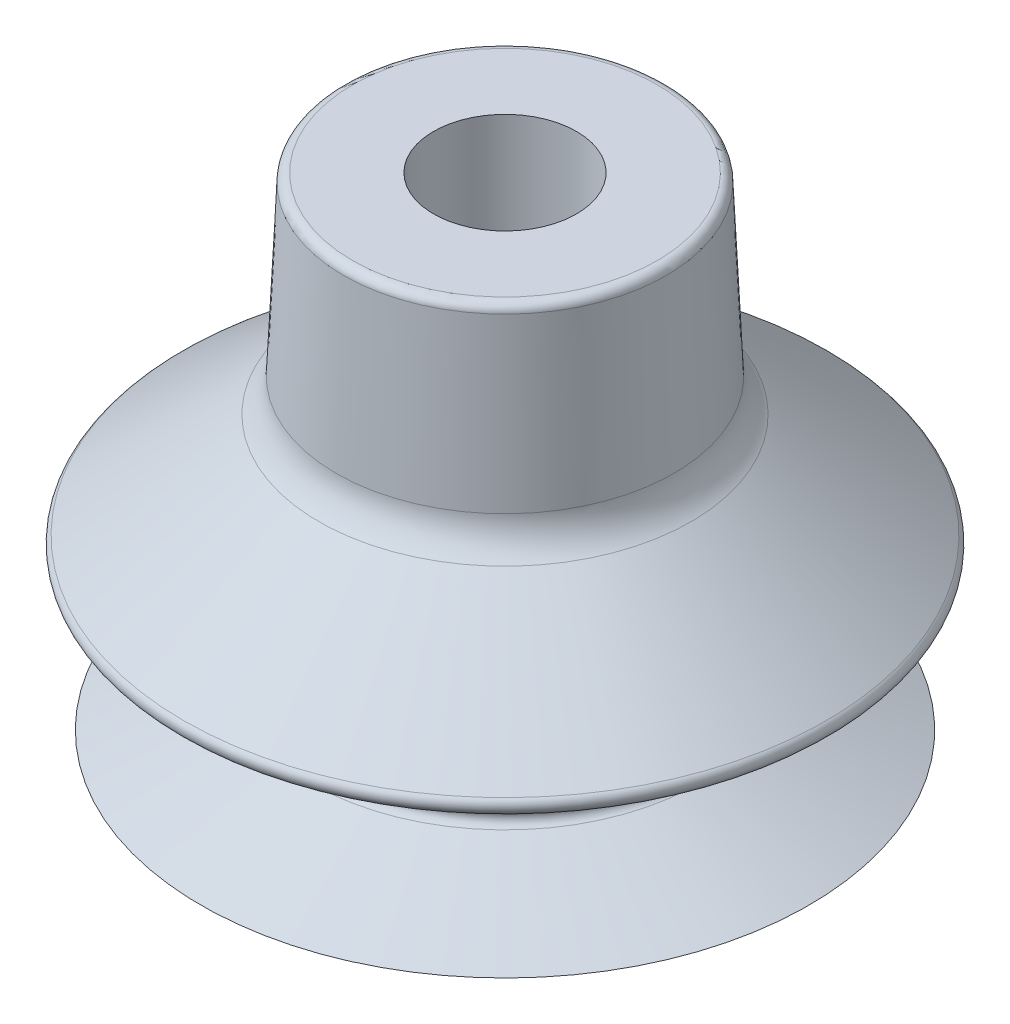
ISO-10303-21;
HEADER;
FILE_DESCRIPTION(('STEP AP214'),'2;1');
FILE_NAME('part.step','',(''),(''),'','','');
FILE_SCHEMA(('AUTOMOTIVE_DESIGN { 1 0 10303 214 1 1 1 1 }'));
ENDSEC;
DATA;
#1=APPLICATION_CONTEXT('core data for automotive mechanical design processes');
#2=APPLICATION_PROTOCOL_DEFINITION('international standard','automotive_design',2000,#1);
#3=PRODUCT_CONTEXT('',#1,'mechanical');
#4=PRODUCT('Part','Part','',(#3));
#5=PRODUCT_RELATED_PRODUCT_CATEGORY('part','',(#4));
#6=PRODUCT_DEFINITION_FORMATION('','',#4);
#7=PRODUCT_DEFINITION_CONTEXT('part definition',#1,'design');
#8=PRODUCT_DEFINITION('design','',#6,#7);
#9=PRODUCT_DEFINITION_SHAPE('','',#8);
#10=(LENGTH_UNIT() NAMED_UNIT(*) SI_UNIT(.MILLI.,.METRE.));
#11=(NAMED_UNIT(*) PLANE_ANGLE_UNIT() SI_UNIT($,.RADIAN.));
#12=(NAMED_UNIT(*) SI_UNIT($,.STERADIAN.) SOLID_ANGLE_UNIT());
#13=UNCERTAINTY_MEASURE_WITH_UNIT(LENGTH_MEASURE(1.E-05),#10,'distance_accuracy_value','');
#14=(GEOMETRIC_REPRESENTATION_CONTEXT(3) GLOBAL_UNCERTAINTY_ASSIGNED_CONTEXT((#13)) GLOBAL_UNIT_ASSIGNED_CONTEXT((#10,
#11,#12)) REPRESENTATION_CONTEXT('',''));
#15=CARTESIAN_POINT('',(0.,0.,0.));
#16=DIRECTION('',(0.,0.,1.));
#17=DIRECTION('',(1.,0.,0.));
#18=AXIS2_PLACEMENT_3D('',#15,#16,#17);
#19=CARTESIAN_POINT('',(0.,0.,0.));
#20=DIRECTION('',(0.,-1.,0.));
#21=DIRECTION('',(0.,0.,-1.));
#22=AXIS2_PLACEMENT_3D('',#19,#20,#21);
#23=CONICAL_SURFACE('',#22,18.5,0.90975315794421);
#24=CARTESIAN_POINT('',(0.,6.2920590469125,0.));
#25=DIRECTION('',(0.,-1.,0.));
#26=DIRECTION('',(0.,0.,-1.));
#27=AXIS2_PLACEMENT_3D('',#24,#25,#26);
#28=CIRCLE('',#27,10.4102097968268);
#29=CARTESIAN_POINT('',(0.,6.2920590469125,-10.4102097968268));
#30=VERTEX_POINT('',#29);
#31=EDGE_CURVE('E37',#30,#30,#28,.T.);
#32=ORIENTED_EDGE('',*,*,#31,.T.);
#33=EDGE_LOOP('',(#32));
#34=FACE_BOUND('',#33,.T.);
#35=CARTESIAN_POINT('',(0.,0.419705562361745,0.));
#36=DIRECTION('',(0.,1.,0.));
#37=DIRECTION('',(0.,0.,1.));
#38=AXIS2_PLACEMENT_3D('',#35,#36,#37);
#39=CIRCLE('',#38,17.9603785626778);
#40=CARTESIAN_POINT('',(0.,0.419705562361745,17.9603785626778));
#41=VERTEX_POINT('',#40);
#42=EDGE_CURVE('E50',#41,#41,#39,.T.);
#43=ORIENTED_EDGE('',*,*,#42,.T.);
#44=EDGE_LOOP('',(#43));
#45=FACE_BOUND('',#44,.T.);
#46=ADVANCED_FACE('F30',(#34,#45),#23,.T.);
#47=CARTESIAN_POINT('',(0.,-5.822892874515,0.));
#48=DIRECTION('',(0.,1.,0.));
#49=DIRECTION('',(0.,0.,1.));
#50=AXIS2_PLACEMENT_3D('',#47,#48,#49);
#51=CONICAL_SURFACE('',#50,10.0238595360316,0.968865864937722);
#52=CARTESIAN_POINT('',(0.,-0.387092574800041,0.));
#53=DIRECTION('',(0.,-1.,0.));
#54=DIRECTION('',(0.,0.,-1.));
#55=AXIS2_PLACEMENT_3D('',#52,#53,#54);
#56=CIRCLE('',#55,17.9365256055243);
#57=CARTESIAN_POINT('',(0.,-0.387092574800041,-17.9365256055243));
#58=VERTEX_POINT('',#57);
#59=EDGE_CURVE('E53',#58,#58,#56,.T.);
#60=ORIENTED_EDGE('',*,*,#59,.T.);
#61=EDGE_LOOP('',(#60));
#62=FACE_BOUND('',#61,.T.);
#63=CARTESIAN_POINT('',(0.,-5.32221728329887,0.));
#64=DIRECTION('',(0.,1.,0.));
#65=DIRECTION('',(0.,0.,1.));
#66=AXIS2_PLACEMENT_3D('',#63,#64,#65);
#67=CIRCLE('',#66,10.7526719544435);
#68=CARTESIAN_POINT('',(0.,-5.32221728329887,10.7526719544435));
#69=VERTEX_POINT('',#68);
#70=EDGE_CURVE('E56',#69,#69,#67,.T.);
#71=ORIENTED_EDGE('',*,*,#70,.T.);
#72=EDGE_LOOP('',(#71));
#73=FACE_BOUND('',#72,.T.);
#74=ADVANCED_FACE('F111',(#62,#73),#51,.T.);
#75=CARTESIAN_POINT('',(0.,-9.,0.));
#76=DIRECTION('',(0.,-1.,0.));
#77=DIRECTION('',(0.,0.,-1.));
#78=AXIS2_PLACEMENT_3D('',#75,#76,#77);
#79=CONICAL_SURFACE('',#78,17.,1.14344033221867);
#80=CARTESIAN_POINT('',(0.,-6.18937170170866,0.));
#81=DIRECTION('',(0.,-1.,0.));
#82=DIRECTION('',(0.,0.,-1.));
#83=AXIS2_PLACEMENT_3D('',#80,#81,#82);
#84=CIRCLE('',#83,10.8285562851798);
#85=CARTESIAN_POINT('',(0.,-6.18937170170866,-10.8285562851798));
#86=VERTEX_POINT('',#85);
#87=EDGE_CURVE('E45',#86,#86,#84,.T.);
#88=ORIENTED_EDGE('',*,*,#87,.T.);
#89=EDGE_LOOP('',(#88));
#90=FACE_BOUND('',#89,.T.);
#91=CARTESIAN_POINT('',(0.,-9.,0.));
#92=DIRECTION('',(0.,-1.,0.));
#93=DIRECTION('',(0.,0.,-1.));
#94=AXIS2_PLACEMENT_3D('',#91,#92,#93);
#95=CIRCLE('',#94,17.);
#96=CARTESIAN_POINT('',(0.,-9.,-17.));
#97=VERTEX_POINT('',#96);
#98=EDGE_CURVE('E80',#97,#97,#95,.T.);
#99=ORIENTED_EDGE('',*,*,#98,.F.);
#100=EDGE_LOOP('',(#99));
#101=FACE_BOUND('',#100,.T.);
#102=ADVANCED_FACE('F116',(#90,#101),#79,.T.);
#103=CARTESIAN_POINT('',(17.,-9.,0.));
#104=DIRECTION('',(0.,-1.,0.));
#105=DIRECTION('',(0.,0.,-1.));
#106=AXIS2_PLACEMENT_3D('',#103,#104,#105);
#107=PLANE('',#106);
#108=ORIENTED_EDGE('',*,*,#98,.T.);
#109=EDGE_LOOP('',(#108));
#110=FACE_BOUND('',#109,.T.);
#111=CARTESIAN_POINT('',(0.,-9.,0.));
#112=DIRECTION('',(0.,-1.,0.));
#113=DIRECTION('',(0.,0.,-1.));
#114=AXIS2_PLACEMENT_3D('',#111,#112,#113);
#115=CIRCLE('',#114,14.5872570754788);
#116=CARTESIAN_POINT('',(0.,-9.,-14.5872570754788));
#117=VERTEX_POINT('',#116);
#118=EDGE_CURVE('E83',#117,#117,#115,.T.);
#119=ORIENTED_EDGE('',*,*,#118,.F.);
#120=EDGE_LOOP('',(#119));
#121=FACE_BOUND('',#120,.T.);
#122=ADVANCED_FACE('F163',(#110,#121),#107,.T.);
#123=CARTESIAN_POINT('',(0.,-6.,0.));
#124=DIRECTION('',(0.,-1.,0.));
#125=DIRECTION('',(0.,0.,-1.));
#126=AXIS2_PLACEMENT_3D('',#123,#124,#125);
#127=CONICAL_SURFACE('',#126,8.,1.14344033221867);
#128=CARTESIAN_POINT('',(0.,-6.36647882719366,0.));
#129=DIRECTION('',(0.,1.,0.));
#130=DIRECTION('',(0.,0.,1.));
#131=AXIS2_PLACEMENT_3D('',#128,#129,#130);
#132=CIRCLE('',#131,8.80469674914821);
#133=CARTESIAN_POINT('',(0.,-6.36647882719366,8.80469674914821));
#134=VERTEX_POINT('',#133);
#135=EDGE_CURVE('E41',#134,#134,#132,.T.);
#136=ORIENTED_EDGE('',*,*,#135,.T.);
#137=EDGE_LOOP('',(#136));
#138=FACE_BOUND('',#137,.T.);
#139=ORIENTED_EDGE('',*,*,#118,.T.);
#140=EDGE_LOOP('',(#139));
#141=FACE_BOUND('',#140,.T.);
#142=ADVANCED_FACE('F154',(#138,#141),#127,.F.);
#143=CARTESIAN_POINT('',(0.,0.0500589073471671,0.));
#144=DIRECTION('',(0.,1.,0.));
#145=DIRECTION('',(0.,0.,1.));
#146=AXIS2_PLACEMENT_3D('',#143,#144,#145);
#147=CONICAL_SURFACE('',#146,16.8068165118406,0.968865864937722);
#148=CARTESIAN_POINT('',(0.,-0.337033667452878,0.));
#149=DIRECTION('',(0.,1.,0.));
#150=DIRECTION('',(0.,0.,1.));
#151=AXIS2_PLACEMENT_3D('',#148,#149,#150);
#152=CIRCLE('',#151,16.2433421173649);
#153=CARTESIAN_POINT('',(0.,-0.337033667452878,16.2433421173649));
#154=VERTEX_POINT('',#153);
#155=EDGE_CURVE('E59',#154,#154,#152,.T.);
#156=ORIENTED_EDGE('',*,*,#155,.T.);
#157=EDGE_LOOP('',(#156));
#158=FACE_BOUND('',#157,.T.);
#159=CARTESIAN_POINT('',(0.,-5.49932440878387,0.));
#160=DIRECTION('',(0.,-1.,0.));
#161=DIRECTION('',(0.,0.,-1.));
#162=AXIS2_PLACEMENT_3D('',#159,#160,#161);
#163=CIRCLE('',#162,8.72881241841183);
#164=CARTESIAN_POINT('',(0.,-5.49932440878387,-8.72881241841183));
#165=VERTEX_POINT('',#164);
#166=EDGE_CURVE('E62',#165,#165,#163,.T.);
#167=ORIENTED_EDGE('',*,*,#166,.T.);
#168=EDGE_LOOP('',(#167));
#169=FACE_BOUND('',#168,.T.);
#170=ADVANCED_FACE('F152',(#158,#169),#147,.F.);
#171=CARTESIAN_POINT('',(0.,5.,0.));
#172=DIRECTION('',(0.,-1.,0.));
#173=DIRECTION('',(0.,0.,-1.));
#174=AXIS2_PLACEMENT_3D('',#171,#172,#173);
#175=CONICAL_SURFACE('',#174,10.4426065355727,0.90975315794421);
#176=CARTESIAN_POINT('',(0.,4.89467610868816,0.));
#177=DIRECTION('',(0.,-1.,0.));
#178=DIRECTION('',(0.,0.,-1.));
#179=AXIS2_PLACEMENT_3D('',#176,#177,#178);
#180=CIRCLE('',#179,10.5780229672593);
#181=CARTESIAN_POINT('',(0.,4.89467610868816,-10.5780229672593));
#182=VERTEX_POINT('',#181);
#183=EDGE_CURVE('E71',#182,#182,#180,.F.);
#184=ORIENTED_EDGE('',*,*,#183,.T.);
#185=EDGE_LOOP('',(#184));
#186=FACE_BOUND('',#185,.T.);
#187=CARTESIAN_POINT('',(0.,0.469764469708915,0.));
#188=DIRECTION('',(0.,-1.,0.));
#189=DIRECTION('',(0.,0.,-1.));
#190=AXIS2_PLACEMENT_3D('',#187,#188,#189);
#191=CIRCLE('',#190,16.2671950745183);
#192=CARTESIAN_POINT('',(0.,0.469764469708915,-16.2671950745183));
#193=VERTEX_POINT('',#192);
#194=EDGE_CURVE('E74',#193,#193,#191,.T.);
#195=ORIENTED_EDGE('',*,*,#194,.T.);
#196=EDGE_LOOP('',(#195));
#197=FACE_BOUND('',#196,.T.);
#198=ADVANCED_FACE('F107',(#186,#197),#175,.F.);
#199=CARTESIAN_POINT('',(10.4426065355727,5.,0.));
#200=DIRECTION('',(0.,-1.,0.));
#201=DIRECTION('',(0.,0.,-1.));
#202=AXIS2_PLACEMENT_3D('',#199,#200,#201);
#203=PLANE('',#202);
#204=CARTESIAN_POINT('',(0.,5.,0.));
#205=DIRECTION('',(0.,-1.,0.));
#206=DIRECTION('',(0.,0.,-1.));
#207=AXIS2_PLACEMENT_3D('',#204,#205,#206);
#208=CIRCLE('',#207,10.2710526605018);
#209=CARTESIAN_POINT('',(0.,5.,-10.2710526605018));
#210=VERTEX_POINT('',#209);
#211=EDGE_CURVE('E77',#210,#210,#208,.T.);
#212=ORIENTED_EDGE('',*,*,#211,.T.);
#213=EDGE_LOOP('',(#212));
#214=FACE_BOUND('',#213,.T.);
#215=CARTESIAN_POINT('',(0.,5.,0.));
#216=DIRECTION('',(0.,-1.,0.));
#217=DIRECTION('',(0.,0.,-1.));
#218=AXIS2_PLACEMENT_3D('',#215,#216,#217);
#219=CIRCLE('',#218,4.);
#220=CARTESIAN_POINT('',(0.,5.,-4.));
#221=VERTEX_POINT('',#220);
#222=EDGE_CURVE('E86',#221,#221,#219,.T.);
#223=ORIENTED_EDGE('',*,*,#222,.F.);
#224=EDGE_LOOP('',(#223));
#225=FACE_BOUND('',#224,.T.);
#226=ADVANCED_FACE('F97',(#214,#225),#203,.T.);
#227=CARTESIAN_POINT('',(0.,0.,0.));
#228=DIRECTION('',(0.,-1.,0.));
#229=DIRECTION('',(0.,0.,-1.));
#230=AXIS2_PLACEMENT_3D('',#227,#228,#229);
#231=CYLINDRICAL_SURFACE('',#230,4.);
#232=ORIENTED_EDGE('',*,*,#222,.T.);
#233=EDGE_LOOP('',(#232));
#234=FACE_BOUND('',#233,.T.);
#235=CARTESIAN_POINT('',(0.,18.,0.));
#236=DIRECTION('',(0.,-1.,0.));
#237=DIRECTION('',(0.,0.,-1.));
#238=AXIS2_PLACEMENT_3D('',#235,#236,#237);
#239=CIRCLE('',#238,4.);
#240=CARTESIAN_POINT('',(0.,18.,-4.));
#241=VERTEX_POINT('',#240);
#242=EDGE_CURVE('E89',#241,#241,#239,.T.);
#243=ORIENTED_EDGE('',*,*,#242,.F.);
#244=EDGE_LOOP('',(#243));
#245=FACE_BOUND('',#244,.T.);
#246=ADVANCED_FACE('F95',(#234,#245),#231,.F.);
#247=CARTESIAN_POINT('',(4.,18.,0.));
#248=DIRECTION('',(0.,1.,0.));
#249=DIRECTION('',(0.,0.,1.));
#250=AXIS2_PLACEMENT_3D('',#247,#248,#249);
#251=PLANE('',#250);
#252=CARTESIAN_POINT('',(0.,18.,0.));
#253=DIRECTION('',(0.,1.,0.));
#254=DIRECTION('',(0.,0.,1.));
#255=AXIS2_PLACEMENT_3D('',#252,#253,#254);
#256=CIRCLE('',#255,8.52221101032852);
#257=CARTESIAN_POINT('',(0.,18.,8.52221101032852));
#258=VERTEX_POINT('',#257);
#259=EDGE_CURVE('E65',#258,#258,#256,.T.);
#260=ORIENTED_EDGE('',*,*,#259,.T.);
#261=EDGE_LOOP('',(#260));
#262=FACE_BOUND('',#261,.T.);
#263=ORIENTED_EDGE('',*,*,#242,.T.);
#264=EDGE_LOOP('',(#263));
#265=FACE_BOUND('',#264,.T.);
#266=ADVANCED_FACE('F93',(#262,#265),#251,.T.);
#267=CARTESIAN_POINT('',(0.,7.,0.));
#268=DIRECTION('',(0.,-1.,0.));
#269=DIRECTION('',(0.,0.,-1.));
#270=AXIS2_PLACEMENT_3D('',#267,#268,#269);
#271=CONICAL_SURFACE('',#270,9.5,0.0454232794215771);
#272=CARTESIAN_POINT('',(0.,8.1519204380567,0.));
#273=DIRECTION('',(0.,-1.,0.));
#274=DIRECTION('',(0.,0.,-1.));
#275=AXIS2_PLACEMENT_3D('',#272,#273,#274);
#276=CIRCLE('',#275,9.44763998008833);
#277=CARTESIAN_POINT('',(0.,8.1519204380567,-9.44763998008833));
#278=VERTEX_POINT('',#277);
#279=EDGE_CURVE('E10',#278,#278,#276,.F.);
#280=ORIENTED_EDGE('',*,*,#279,.T.);
#281=EDGE_LOOP('',(#280));
#282=FACE_BOUND('',#281,.T.);
#283=CARTESIAN_POINT('',(0.,17.5227038304593,0.));
#284=DIRECTION('',(0.,1.,0.));
#285=DIRECTION('',(0.,0.,1.));
#286=AXIS2_PLACEMENT_3D('',#283,#284,#285);
#287=CIRCLE('',#286,9.02169528043366);
#288=CARTESIAN_POINT('',(0.,17.5227038304593,9.02169528043366));
#289=VERTEX_POINT('',#288);
#290=EDGE_CURVE('E68',#289,#289,#287,.F.);
#291=ORIENTED_EDGE('',*,*,#290,.T.);
#292=EDGE_LOOP('',(#291));
#293=FACE_BOUND('',#292,.T.);
#294=ADVANCED_FACE('F104',(#282,#293),#271,.T.);
#295=CARTESIAN_POINT('',(0.,4.5,0.));
#296=DIRECTION('',(0.,-1.,0.));
#297=DIRECTION('',(0.,0.,-1.));
#298=AXIS2_PLACEMENT_3D('',#295,#296,#297);
#299=TOROIDAL_SURFACE('',#298,10.2710526605018,0.5);
#300=ORIENTED_EDGE('',*,*,#183,.F.);
#301=EDGE_LOOP('',(#300));
#302=FACE_BOUND('',#301,.T.);
#303=ORIENTED_EDGE('',*,*,#211,.F.);
#304=EDGE_LOOP('',(#303));
#305=FACE_BOUND('',#304,.T.);
#306=ADVANCED_FACE('F122',(#302,#305),#299,.F.);
#307=CARTESIAN_POINT('',(0.,17.5,0.));
#308=DIRECTION('',(0.,1.,0.));
#309=DIRECTION('',(0.,0.,1.));
#310=AXIS2_PLACEMENT_3D('',#307,#308,#309);
#311=TOROIDAL_SURFACE('',#310,8.52221101032852,0.5);
#312=ORIENTED_EDGE('',*,*,#259,.F.);
#313=EDGE_LOOP('',(#312));
#314=FACE_BOUND('',#313,.T.);
#315=ORIENTED_EDGE('',*,*,#290,.F.);
#316=EDGE_LOOP('',(#315));
#317=FACE_BOUND('',#316,.T.);
#318=ADVANCED_FACE('F125',(#314,#317),#311,.T.);
#319=CARTESIAN_POINT('',(0.,0.0750883610207503,0.));
#320=DIRECTION('',(0.,-1.,0.));
#321=DIRECTION('',(0.,0.,-1.));
#322=AXIS2_PLACEMENT_3D('',#319,#320,#321);
#323=TOROIDAL_SURFACE('',#322,15.9602247677609,0.5);
#324=ORIENTED_EDGE('',*,*,#155,.F.);
#325=EDGE_LOOP('',(#324));
#326=FACE_BOUND('',#325,.T.);
#327=ORIENTED_EDGE('',*,*,#194,.F.);
#328=EDGE_LOOP('',(#327));
#329=FACE_BOUND('',#328,.T.);
#330=ADVANCED_FACE('F129',(#326,#329),#323,.F.);
#331=CARTESIAN_POINT('',(0.,0.0250294536735833,0.));
#332=DIRECTION('',(0.,1.,0.));
#333=DIRECTION('',(0.,0.,1.));
#334=AXIS2_PLACEMENT_3D('',#331,#332,#333);
#335=TOROIDAL_SURFACE('',#334,17.6534082559203,0.5);
#336=ORIENTED_EDGE('',*,*,#42,.F.);
#337=EDGE_LOOP('',(#336));
#338=FACE_BOUND('',#337,.T.);
#339=ORIENTED_EDGE('',*,*,#59,.F.);
#340=EDGE_LOOP('',(#339));
#341=FACE_BOUND('',#340,.T.);
#342=ADVANCED_FACE('F133',(#338,#341),#335,.T.);
#343=CARTESIAN_POINT('',(0.,-5.7343393117725,0.));
#344=DIRECTION('',(0.,-1.,0.));
#345=DIRECTION('',(0.,0.,-1.));
#346=AXIS2_PLACEMENT_3D('',#343,#344,#345);
#347=TOROIDAL_SURFACE('',#346,11.0357893040474,0.5);
#348=ORIENTED_EDGE('',*,*,#70,.F.);
#349=EDGE_LOOP('',(#348));
#350=FACE_BOUND('',#349,.T.);
#351=ORIENTED_EDGE('',*,*,#87,.F.);
#352=EDGE_LOOP('',(#351));
#353=FACE_BOUND('',#352,.T.);
#354=ADVANCED_FACE('F137',(#350,#353),#347,.F.);
#355=CARTESIAN_POINT('',(0.,-5.9114464372575,0.));
#356=DIRECTION('',(0.,1.,0.));
#357=DIRECTION('',(0.,0.,1.));
#358=AXIS2_PLACEMENT_3D('',#355,#356,#357);
#359=TOROIDAL_SURFACE('',#358,9.01192976801582,0.5);
#360=ORIENTED_EDGE('',*,*,#135,.F.);
#361=EDGE_LOOP('',(#360));
#362=FACE_BOUND('',#361,.T.);
#363=ORIENTED_EDGE('',*,*,#166,.F.);
#364=EDGE_LOOP('',(#363));
#365=FACE_BOUND('',#364,.T.);
#366=ADVANCED_FACE('F140',(#362,#365),#359,.T.);
#367=CARTESIAN_POINT('',(0.,8.26543959035332,0.));
#368=DIRECTION('',(0.,-1.,0.));
#369=DIRECTION('',(0.,0.,-1.));
#370=AXIS2_PLACEMENT_3D('',#367,#368,#369);
#371=TOROIDAL_SURFACE('',#370,11.9450613306141,2.5);
#372=ORIENTED_EDGE('',*,*,#279,.F.);
#373=EDGE_LOOP('',(#372));
#374=FACE_BOUND('',#373,.T.);
#375=ORIENTED_EDGE('',*,*,#31,.F.);
#376=EDGE_LOOP('',(#375));
#377=FACE_BOUND('',#376,.T.);
#378=ADVANCED_FACE('F32',(#374,#377),#371,.F.);
#379=CLOSED_SHELL('',(#46,#74,#102,#122,#142,#170,#198,#226,#246,#266,#294,#306,#318,#330,#342,
#354,#366,#378));
#380=MANIFOLD_SOLID_BREP('B2',#379);
#381=ADVANCED_BREP_SHAPE_REPRESENTATION('',(#18,#380),#14);
#382=SHAPE_DEFINITION_REPRESENTATION(#9,#381);
ENDSEC;
END-ISO-10303-21;
